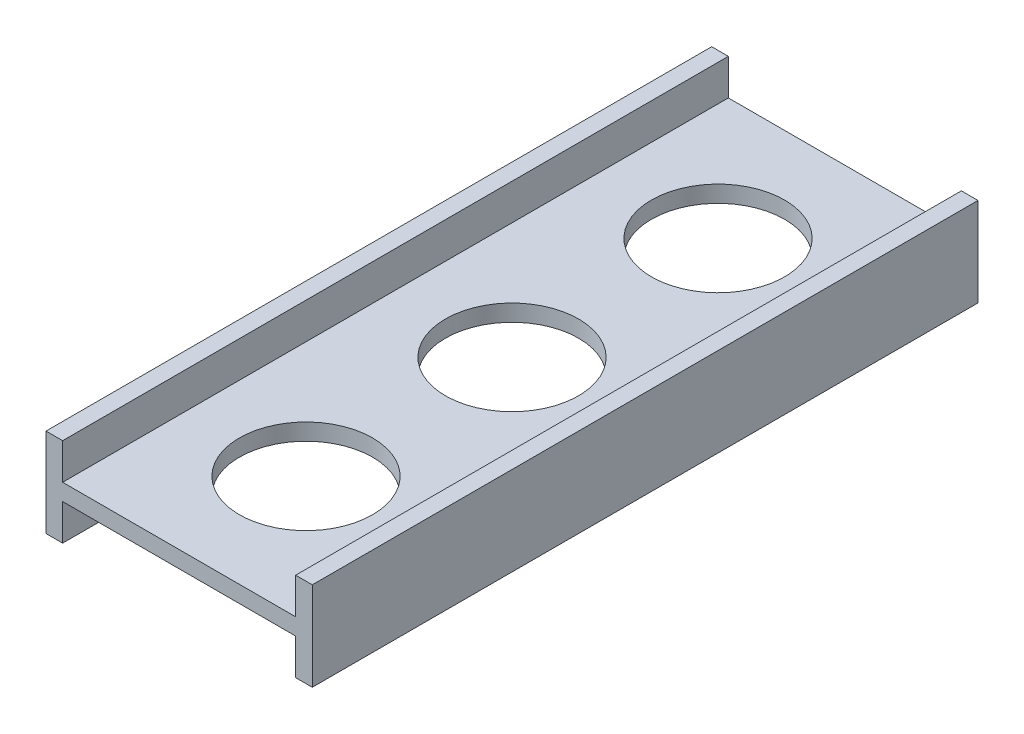
ISO-10303-21;
HEADER;
FILE_DESCRIPTION(('STEP AP214'),'2;1');
FILE_NAME('part.step','',(''),(''),'','','');
FILE_SCHEMA(('AUTOMOTIVE_DESIGN { 1 0 10303 214 1 1 1 1 }'));
ENDSEC;
DATA;
#1=APPLICATION_CONTEXT('core data for automotive mechanical design processes');
#2=APPLICATION_PROTOCOL_DEFINITION('international standard','automotive_design',2000,#1);
#3=PRODUCT_CONTEXT('',#1,'mechanical');
#4=PRODUCT('Part','Part','',(#3));
#5=PRODUCT_RELATED_PRODUCT_CATEGORY('part','',(#4));
#6=PRODUCT_DEFINITION_FORMATION('','',#4);
#7=PRODUCT_DEFINITION_CONTEXT('part definition',#1,'design');
#8=PRODUCT_DEFINITION('design','',#6,#7);
#9=PRODUCT_DEFINITION_SHAPE('','',#8);
#10=(LENGTH_UNIT() NAMED_UNIT(*) SI_UNIT(.MILLI.,.METRE.));
#11=(NAMED_UNIT(*) PLANE_ANGLE_UNIT() SI_UNIT($,.RADIAN.));
#12=(NAMED_UNIT(*) SI_UNIT($,.STERADIAN.) SOLID_ANGLE_UNIT());
#13=UNCERTAINTY_MEASURE_WITH_UNIT(LENGTH_MEASURE(1.E-05),#10,'distance_accuracy_value','');
#14=(GEOMETRIC_REPRESENTATION_CONTEXT(3) GLOBAL_UNCERTAINTY_ASSIGNED_CONTEXT((#13)) GLOBAL_UNIT_ASSIGNED_CONTEXT((#10,
#11,#12)) REPRESENTATION_CONTEXT('',''));
#15=CARTESIAN_POINT('',(0.,0.,0.));
#16=DIRECTION('',(0.,0.,1.));
#17=DIRECTION('',(1.,0.,0.));
#18=AXIS2_PLACEMENT_3D('',#15,#16,#17);
#19=CARTESIAN_POINT('',(0.,50.8,-381.));
#20=DIRECTION('',(-1.,0.,0.));
#21=DIRECTION('',(0.,-1.,0.));
#22=AXIS2_PLACEMENT_3D('',#19,#20,#21);
#23=PLANE('',#22);
#24=DIRECTION('',(0.,-1.,0.));
#25=VECTOR('',#24,1.);
#26=CARTESIAN_POINT('',(0.,50.8,0.));
#27=LINE('',#26,#25);
#28=CARTESIAN_POINT('',(0.,50.8,0.));
#29=VERTEX_POINT('',#28);
#30=CARTESIAN_POINT('',(0.,0.,0.));
#31=VERTEX_POINT('',#30);
#32=EDGE_CURVE('E153',#29,#31,#27,.T.);
#33=ORIENTED_EDGE('',*,*,#32,.F.);
#34=DIRECTION('',(0.,0.,1.));
#35=VECTOR('',#34,1.);
#36=CARTESIAN_POINT('',(0.,50.8,-381.));
#37=LINE('',#36,#35);
#38=CARTESIAN_POINT('',(0.,50.8,-381.));
#39=VERTEX_POINT('',#38);
#40=EDGE_CURVE('E11',#39,#29,#37,.T.);
#41=ORIENTED_EDGE('',*,*,#40,.F.);
#42=DIRECTION('',(0.,-1.,0.));
#43=VECTOR('',#42,1.);
#44=CARTESIAN_POINT('',(0.,50.8,-381.));
#45=LINE('',#44,#43);
#46=CARTESIAN_POINT('',(0.,0.,-381.));
#47=VERTEX_POINT('',#46);
#48=EDGE_CURVE('E186',#39,#47,#45,.T.);
#49=ORIENTED_EDGE('',*,*,#48,.T.);
#50=DIRECTION('',(0.,0.,1.));
#51=VECTOR('',#50,1.);
#52=CARTESIAN_POINT('',(0.,0.,-381.));
#53=LINE('',#52,#51);
#54=EDGE_CURVE('E99',#47,#31,#53,.T.);
#55=ORIENTED_EDGE('',*,*,#54,.T.);
#56=EDGE_LOOP('',(#33,#41,#49,#55));
#57=FACE_BOUND('',#56,.T.);
#58=ADVANCED_FACE('F31',(#57),#23,.T.);
#59=CARTESIAN_POINT('',(9.52500000000001,50.8,-381.));
#60=DIRECTION('',(0.,1.,0.));
#61=DIRECTION('',(0.,0.,1.));
#62=AXIS2_PLACEMENT_3D('',#59,#60,#61);
#63=PLANE('',#62);
#64=DIRECTION('',(-1.,0.,0.));
#65=VECTOR('',#64,1.);
#66=CARTESIAN_POINT('',(9.52500000000001,50.8,0.));
#67=LINE('',#66,#65);
#68=CARTESIAN_POINT('',(9.52500000000001,50.8,0.));
#69=VERTEX_POINT('',#68);
#70=EDGE_CURVE('E184',#69,#29,#67,.T.);
#71=ORIENTED_EDGE('',*,*,#70,.F.);
#72=DIRECTION('',(0.,0.,1.));
#73=VECTOR('',#72,1.);
#74=CARTESIAN_POINT('',(9.52500000000001,50.8,-381.));
#75=LINE('',#74,#73);
#76=CARTESIAN_POINT('',(9.52500000000001,50.8,-381.));
#77=VERTEX_POINT('',#76);
#78=EDGE_CURVE('E40',#77,#69,#75,.T.);
#79=ORIENTED_EDGE('',*,*,#78,.F.);
#80=DIRECTION('',(-1.,0.,0.));
#81=VECTOR('',#80,1.);
#82=CARTESIAN_POINT('',(9.52500000000001,50.8,-381.));
#83=LINE('',#82,#81);
#84=EDGE_CURVE('E143',#77,#39,#83,.T.);
#85=ORIENTED_EDGE('',*,*,#84,.T.);
#86=ORIENTED_EDGE('',*,*,#40,.T.);
#87=EDGE_LOOP('',(#71,#79,#85,#86));
#88=FACE_BOUND('',#87,.T.);
#89=ADVANCED_FACE('F268',(#88),#63,.T.);
#90=CARTESIAN_POINT('',(9.525,30.1752,-381.));
#91=DIRECTION('',(1.,0.,0.));
#92=DIRECTION('',(0.,1.,0.));
#93=AXIS2_PLACEMENT_3D('',#90,#91,#92);
#94=PLANE('',#93);
#95=DIRECTION('',(0.,1.,0.));
#96=VECTOR('',#95,1.);
#97=CARTESIAN_POINT('',(9.525,30.1752,0.));
#98=LINE('',#97,#96);
#99=CARTESIAN_POINT('',(9.525,30.1752,0.));
#100=VERTEX_POINT('',#99);
#101=EDGE_CURVE('E130',#100,#69,#98,.T.);
#102=ORIENTED_EDGE('',*,*,#101,.F.);
#103=DIRECTION('',(0.,0.,1.));
#104=VECTOR('',#103,1.);
#105=CARTESIAN_POINT('',(9.525,30.1752,-381.));
#106=LINE('',#105,#104);
#107=CARTESIAN_POINT('',(9.525,30.1752,-381.));
#108=VERTEX_POINT('',#107);
#109=EDGE_CURVE('E125',#108,#100,#106,.T.);
#110=ORIENTED_EDGE('',*,*,#109,.F.);
#111=DIRECTION('',(0.,1.,0.));
#112=VECTOR('',#111,1.);
#113=CARTESIAN_POINT('',(9.525,30.1752,-381.));
#114=LINE('',#113,#112);
#115=EDGE_CURVE('E128',#108,#77,#114,.T.);
#116=ORIENTED_EDGE('',*,*,#115,.T.);
#117=ORIENTED_EDGE('',*,*,#78,.T.);
#118=EDGE_LOOP('',(#102,#110,#116,#117));
#119=FACE_BOUND('',#118,.T.);
#120=ADVANCED_FACE('F127',(#119),#94,.T.);
#121=CARTESIAN_POINT('',(142.875,30.1752,-381.));
#122=DIRECTION('',(0.,1.,0.));
#123=DIRECTION('',(-1.,0.,0.));
#124=AXIS2_PLACEMENT_3D('',#121,#122,#123);
#125=PLANE('',#124);
#126=CARTESIAN_POINT('',(76.2,30.1752,-72.5919338839558));
#127=DIRECTION('',(0.,1.,0.));
#128=DIRECTION('',(1.,0.,0.));
#129=AXIS2_PLACEMENT_3D('',#126,#127,#128);
#130=CIRCLE('',#129,38.1);
#131=CARTESIAN_POINT('',(114.3,30.1752,-72.5919338839558));
#132=VERTEX_POINT('',#131);
#133=EDGE_CURVE('E219',#132,#132,#130,.T.);
#134=ORIENTED_EDGE('',*,*,#133,.F.);
#135=EDGE_LOOP('',(#134));
#136=FACE_BOUND('',#135,.T.);
#137=CARTESIAN_POINT('',(76.2,30.1752,-308.408066116044));
#138=DIRECTION('',(0.,1.,0.));
#139=DIRECTION('',(-1.,0.,0.));
#140=AXIS2_PLACEMENT_3D('',#137,#138,#139);
#141=CIRCLE('',#140,38.1);
#142=CARTESIAN_POINT('',(38.1,30.1752,-308.408066116044));
#143=VERTEX_POINT('',#142);
#144=EDGE_CURVE('E209',#143,#143,#141,.T.);
#145=ORIENTED_EDGE('',*,*,#144,.F.);
#146=EDGE_LOOP('',(#145));
#147=FACE_BOUND('',#146,.T.);
#148=CARTESIAN_POINT('',(76.2,30.1752,-190.5));
#149=DIRECTION('',(0.,1.,0.));
#150=DIRECTION('',(-1.,0.,0.));
#151=AXIS2_PLACEMENT_3D('',#148,#149,#150);
#152=CIRCLE('',#151,38.1);
#153=CARTESIAN_POINT('',(38.1,30.1752,-190.5));
#154=VERTEX_POINT('',#153);
#155=EDGE_CURVE('E206',#154,#154,#152,.T.);
#156=ORIENTED_EDGE('',*,*,#155,.F.);
#157=EDGE_LOOP('',(#156));
#158=FACE_BOUND('',#157,.T.);
#159=DIRECTION('',(-1.,0.,0.));
#160=VECTOR('',#159,1.);
#161=CARTESIAN_POINT('',(142.875,30.1752,0.));
#162=LINE('',#161,#160);
#163=CARTESIAN_POINT('',(142.875,30.1752,0.));
#164=VERTEX_POINT('',#163);
#165=EDGE_CURVE('E181',#164,#100,#162,.T.);
#166=ORIENTED_EDGE('',*,*,#165,.F.);
#167=DIRECTION('',(0.,0.,1.));
#168=VECTOR('',#167,1.);
#169=CARTESIAN_POINT('',(142.875,30.1752,-381.));
#170=LINE('',#169,#168);
#171=CARTESIAN_POINT('',(142.875,30.1752,-381.));
#172=VERTEX_POINT('',#171);
#173=EDGE_CURVE('E135',#172,#164,#170,.T.);
#174=ORIENTED_EDGE('',*,*,#173,.F.);
#175=DIRECTION('',(-1.,0.,0.));
#176=VECTOR('',#175,1.);
#177=CARTESIAN_POINT('',(142.875,30.1752,-381.));
#178=LINE('',#177,#176);
#179=EDGE_CURVE('E141',#172,#108,#178,.T.);
#180=ORIENTED_EDGE('',*,*,#179,.T.);
#181=ORIENTED_EDGE('',*,*,#109,.T.);
#182=EDGE_LOOP('',(#166,#174,#180,#181));
#183=FACE_BOUND('',#182,.T.);
#184=ADVANCED_FACE('F145',(#136,#147,#158,#183),#125,.T.);
#185=CARTESIAN_POINT('',(142.875,50.8,-381.));
#186=DIRECTION('',(-1.,0.,0.));
#187=DIRECTION('',(0.,-1.,0.));
#188=AXIS2_PLACEMENT_3D('',#185,#186,#187);
#189=PLANE('',#188);
#190=DIRECTION('',(0.,-1.,0.));
#191=VECTOR('',#190,1.);
#192=CARTESIAN_POINT('',(142.875,50.8,0.));
#193=LINE('',#192,#191);
#194=CARTESIAN_POINT('',(142.875,50.8,0.));
#195=VERTEX_POINT('',#194);
#196=EDGE_CURVE('E178',#195,#164,#193,.T.);
#197=ORIENTED_EDGE('',*,*,#196,.F.);
#198=DIRECTION('',(0.,0.,1.));
#199=VECTOR('',#198,1.);
#200=CARTESIAN_POINT('',(142.875,50.8,-381.));
#201=LINE('',#200,#199);
#202=CARTESIAN_POINT('',(142.875,50.8,-381.));
#203=VERTEX_POINT('',#202);
#204=EDGE_CURVE('E190',#203,#195,#201,.T.);
#205=ORIENTED_EDGE('',*,*,#204,.F.);
#206=DIRECTION('',(0.,-1.,0.));
#207=VECTOR('',#206,1.);
#208=CARTESIAN_POINT('',(142.875,50.8,-381.));
#209=LINE('',#208,#207);
#210=EDGE_CURVE('E146',#203,#172,#209,.T.);
#211=ORIENTED_EDGE('',*,*,#210,.T.);
#212=ORIENTED_EDGE('',*,*,#173,.T.);
#213=EDGE_LOOP('',(#197,#205,#211,#212));
#214=FACE_BOUND('',#213,.T.);
#215=ADVANCED_FACE('F281',(#214),#189,.T.);
#216=CARTESIAN_POINT('',(152.4,50.8,-381.));
#217=DIRECTION('',(0.,1.,0.));
#218=DIRECTION('',(0.,0.,1.));
#219=AXIS2_PLACEMENT_3D('',#216,#217,#218);
#220=PLANE('',#219);
#221=DIRECTION('',(-1.,0.,0.));
#222=VECTOR('',#221,1.);
#223=CARTESIAN_POINT('',(152.4,50.8,0.));
#224=LINE('',#223,#222);
#225=CARTESIAN_POINT('',(152.4,50.8,0.));
#226=VERTEX_POINT('',#225);
#227=EDGE_CURVE('E175',#226,#195,#224,.T.);
#228=ORIENTED_EDGE('',*,*,#227,.F.);
#229=DIRECTION('',(0.,0.,1.));
#230=VECTOR('',#229,1.);
#231=CARTESIAN_POINT('',(152.4,50.8,-381.));
#232=LINE('',#231,#230);
#233=CARTESIAN_POINT('',(152.4,50.8,-381.));
#234=VERTEX_POINT('',#233);
#235=EDGE_CURVE('E192',#234,#226,#232,.T.);
#236=ORIENTED_EDGE('',*,*,#235,.F.);
#237=DIRECTION('',(-1.,0.,0.));
#238=VECTOR('',#237,1.);
#239=CARTESIAN_POINT('',(152.4,50.8,-381.));
#240=LINE('',#239,#238);
#241=EDGE_CURVE('E148',#234,#203,#240,.T.);
#242=ORIENTED_EDGE('',*,*,#241,.T.);
#243=ORIENTED_EDGE('',*,*,#204,.T.);
#244=EDGE_LOOP('',(#228,#236,#242,#243));
#245=FACE_BOUND('',#244,.T.);
#246=ADVANCED_FACE('F243',(#245),#220,.T.);
#247=CARTESIAN_POINT('',(152.4,0.,-381.));
#248=DIRECTION('',(1.,0.,0.));
#249=DIRECTION('',(0.,0.,-1.));
#250=AXIS2_PLACEMENT_3D('',#247,#248,#249);
#251=PLANE('',#250);
#252=DIRECTION('',(0.,1.,0.));
#253=VECTOR('',#252,1.);
#254=CARTESIAN_POINT('',(152.4,0.,0.));
#255=LINE('',#254,#253);
#256=CARTESIAN_POINT('',(152.4,0.,0.));
#257=VERTEX_POINT('',#256);
#258=EDGE_CURVE('E172',#257,#226,#255,.T.);
#259=ORIENTED_EDGE('',*,*,#258,.F.);
#260=DIRECTION('',(0.,0.,1.));
#261=VECTOR('',#260,1.);
#262=CARTESIAN_POINT('',(152.4,0.,-381.));
#263=LINE('',#262,#261);
#264=CARTESIAN_POINT('',(152.4,0.,-381.));
#265=VERTEX_POINT('',#264);
#266=EDGE_CURVE('E194',#265,#257,#263,.T.);
#267=ORIENTED_EDGE('',*,*,#266,.F.);
#268=DIRECTION('',(0.,1.,0.));
#269=VECTOR('',#268,1.);
#270=CARTESIAN_POINT('',(152.4,0.,-381.));
#271=LINE('',#270,#269);
#272=EDGE_CURVE('E237',#265,#234,#271,.T.);
#273=ORIENTED_EDGE('',*,*,#272,.T.);
#274=ORIENTED_EDGE('',*,*,#235,.T.);
#275=EDGE_LOOP('',(#259,#267,#273,#274));
#276=FACE_BOUND('',#275,.T.);
#277=ADVANCED_FACE('F249',(#276),#251,.T.);
#278=CARTESIAN_POINT('',(142.875,0.,-381.));
#279=DIRECTION('',(0.,-1.,0.));
#280=DIRECTION('',(0.,0.,-1.));
#281=AXIS2_PLACEMENT_3D('',#278,#279,#280);
#282=PLANE('',#281);
#283=DIRECTION('',(1.,0.,0.));
#284=VECTOR('',#283,1.);
#285=CARTESIAN_POINT('',(142.875,0.,0.));
#286=LINE('',#285,#284);
#287=CARTESIAN_POINT('',(142.875,0.,0.));
#288=VERTEX_POINT('',#287);
#289=EDGE_CURVE('E169',#288,#257,#286,.T.);
#290=ORIENTED_EDGE('',*,*,#289,.F.);
#291=DIRECTION('',(0.,0.,1.));
#292=VECTOR('',#291,1.);
#293=CARTESIAN_POINT('',(142.875,0.,-381.));
#294=LINE('',#293,#292);
#295=CARTESIAN_POINT('',(142.875,0.,-381.));
#296=VERTEX_POINT('',#295);
#297=EDGE_CURVE('E196',#296,#288,#294,.T.);
#298=ORIENTED_EDGE('',*,*,#297,.F.);
#299=DIRECTION('',(1.,0.,0.));
#300=VECTOR('',#299,1.);
#301=CARTESIAN_POINT('',(142.875,0.,-381.));
#302=LINE('',#301,#300);
#303=EDGE_CURVE('E234',#296,#265,#302,.T.);
#304=ORIENTED_EDGE('',*,*,#303,.T.);
#305=ORIENTED_EDGE('',*,*,#266,.T.);
#306=EDGE_LOOP('',(#290,#298,#304,#305));
#307=FACE_BOUND('',#306,.T.);
#308=ADVANCED_FACE('F252',(#307),#282,.T.);
#309=CARTESIAN_POINT('',(142.875,20.6248,-381.));
#310=DIRECTION('',(-1.,0.,0.));
#311=DIRECTION('',(0.,0.,1.));
#312=AXIS2_PLACEMENT_3D('',#309,#310,#311);
#313=PLANE('',#312);
#314=DIRECTION('',(0.,-1.,0.));
#315=VECTOR('',#314,1.);
#316=CARTESIAN_POINT('',(142.875,20.6248,0.));
#317=LINE('',#316,#315);
#318=CARTESIAN_POINT('',(142.875,20.6248,0.));
#319=VERTEX_POINT('',#318);
#320=EDGE_CURVE('E166',#319,#288,#317,.T.);
#321=ORIENTED_EDGE('',*,*,#320,.F.);
#322=DIRECTION('',(0.,0.,1.));
#323=VECTOR('',#322,1.);
#324=CARTESIAN_POINT('',(142.875,20.6248,-381.));
#325=LINE('',#324,#323);
#326=CARTESIAN_POINT('',(142.875,20.6248,-381.));
#327=VERTEX_POINT('',#326);
#328=EDGE_CURVE('E198',#327,#319,#325,.T.);
#329=ORIENTED_EDGE('',*,*,#328,.F.);
#330=DIRECTION('',(0.,-1.,0.));
#331=VECTOR('',#330,1.);
#332=CARTESIAN_POINT('',(142.875,20.6248,-381.));
#333=LINE('',#332,#331);
#334=EDGE_CURVE('E231',#327,#296,#333,.T.);
#335=ORIENTED_EDGE('',*,*,#334,.T.);
#336=ORIENTED_EDGE('',*,*,#297,.T.);
#337=EDGE_LOOP('',(#321,#329,#335,#336));
#338=FACE_BOUND('',#337,.T.);
#339=ADVANCED_FACE('F257',(#338),#313,.T.);
#340=CARTESIAN_POINT('',(9.525,20.6248,-381.));
#341=DIRECTION('',(0.,-1.,0.));
#342=DIRECTION('',(0.,0.,-1.));
#343=AXIS2_PLACEMENT_3D('',#340,#341,#342);
#344=PLANE('',#343);
#345=CARTESIAN_POINT('',(76.2,20.6248,-72.5919338839558));
#346=DIRECTION('',(0.,-1.,0.));
#347=DIRECTION('',(0.,0.,-1.));
#348=AXIS2_PLACEMENT_3D('',#345,#346,#347);
#349=CIRCLE('',#348,38.1);
#350=CARTESIAN_POINT('',(76.2,20.6248,-110.691933883956));
#351=VERTEX_POINT('',#350);
#352=EDGE_CURVE('E34',#351,#351,#349,.T.);
#353=ORIENTED_EDGE('',*,*,#352,.F.);
#354=EDGE_LOOP('',(#353));
#355=FACE_BOUND('',#354,.T.);
#356=CARTESIAN_POINT('',(76.2,20.6248,-308.408066116044));
#357=DIRECTION('',(0.,-1.,0.));
#358=DIRECTION('',(0.,0.,-1.));
#359=AXIS2_PLACEMENT_3D('',#356,#357,#358);
#360=CIRCLE('',#359,38.1);
#361=CARTESIAN_POINT('',(76.2,20.6248,-346.508066116044));
#362=VERTEX_POINT('',#361);
#363=EDGE_CURVE('E207',#362,#362,#360,.T.);
#364=ORIENTED_EDGE('',*,*,#363,.F.);
#365=EDGE_LOOP('',(#364));
#366=FACE_BOUND('',#365,.T.);
#367=CARTESIAN_POINT('',(76.2,20.6248,-190.5));
#368=DIRECTION('',(0.,-1.,0.));
#369=DIRECTION('',(0.,0.,-1.));
#370=AXIS2_PLACEMENT_3D('',#367,#368,#369);
#371=CIRCLE('',#370,38.1);
#372=CARTESIAN_POINT('',(76.2,20.6248,-228.6));
#373=VERTEX_POINT('',#372);
#374=EDGE_CURVE('E157',#373,#373,#371,.T.);
#375=ORIENTED_EDGE('',*,*,#374,.F.);
#376=EDGE_LOOP('',(#375));
#377=FACE_BOUND('',#376,.T.);
#378=DIRECTION('',(1.,0.,0.));
#379=VECTOR('',#378,1.);
#380=CARTESIAN_POINT('',(9.525,20.6248,0.));
#381=LINE('',#380,#379);
#382=CARTESIAN_POINT('',(9.525,20.6248,0.));
#383=VERTEX_POINT('',#382);
#384=EDGE_CURVE('E163',#383,#319,#381,.T.);
#385=ORIENTED_EDGE('',*,*,#384,.F.);
#386=DIRECTION('',(0.,0.,1.));
#387=VECTOR('',#386,1.);
#388=CARTESIAN_POINT('',(9.525,20.6248,-381.));
#389=LINE('',#388,#387);
#390=CARTESIAN_POINT('',(9.525,20.6248,-381.));
#391=VERTEX_POINT('',#390);
#392=EDGE_CURVE('E200',#391,#383,#389,.T.);
#393=ORIENTED_EDGE('',*,*,#392,.F.);
#394=DIRECTION('',(1.,0.,0.));
#395=VECTOR('',#394,1.);
#396=CARTESIAN_POINT('',(9.525,20.6248,-381.));
#397=LINE('',#396,#395);
#398=EDGE_CURVE('E228',#391,#327,#397,.T.);
#399=ORIENTED_EDGE('',*,*,#398,.T.);
#400=ORIENTED_EDGE('',*,*,#328,.T.);
#401=EDGE_LOOP('',(#385,#393,#399,#400));
#402=FACE_BOUND('',#401,.T.);
#403=ADVANCED_FACE('F260',(#355,#366,#377,#402),#344,.T.);
#404=CARTESIAN_POINT('',(9.525,0.,-381.));
#405=DIRECTION('',(1.,0.,0.));
#406=DIRECTION('',(0.,0.,-1.));
#407=AXIS2_PLACEMENT_3D('',#404,#405,#406);
#408=PLANE('',#407);
#409=DIRECTION('',(0.,1.,0.));
#410=VECTOR('',#409,1.);
#411=CARTESIAN_POINT('',(9.525,0.,0.));
#412=LINE('',#411,#410);
#413=CARTESIAN_POINT('',(9.525,0.,0.));
#414=VERTEX_POINT('',#413);
#415=EDGE_CURVE('E160',#414,#383,#412,.T.);
#416=ORIENTED_EDGE('',*,*,#415,.F.);
#417=DIRECTION('',(0.,0.,1.));
#418=VECTOR('',#417,1.);
#419=CARTESIAN_POINT('',(9.525,0.,-381.));
#420=LINE('',#419,#418);
#421=CARTESIAN_POINT('',(9.525,0.,-381.));
#422=VERTEX_POINT('',#421);
#423=EDGE_CURVE('E202',#422,#414,#420,.T.);
#424=ORIENTED_EDGE('',*,*,#423,.F.);
#425=DIRECTION('',(0.,1.,0.));
#426=VECTOR('',#425,1.);
#427=CARTESIAN_POINT('',(9.525,0.,-381.));
#428=LINE('',#427,#426);
#429=EDGE_CURVE('E225',#422,#391,#428,.T.);
#430=ORIENTED_EDGE('',*,*,#429,.T.);
#431=ORIENTED_EDGE('',*,*,#392,.T.);
#432=EDGE_LOOP('',(#416,#424,#430,#431));
#433=FACE_BOUND('',#432,.T.);
#434=ADVANCED_FACE('F264',(#433),#408,.T.);
#435=CARTESIAN_POINT('',(0.,0.,-381.));
#436=DIRECTION('',(0.,-1.,0.));
#437=DIRECTION('',(0.,0.,-1.));
#438=AXIS2_PLACEMENT_3D('',#435,#436,#437);
#439=PLANE('',#438);
#440=DIRECTION('',(1.,0.,0.));
#441=VECTOR('',#440,1.);
#442=CARTESIAN_POINT('',(0.,0.,0.));
#443=LINE('',#442,#441);
#444=EDGE_CURVE('E156',#31,#414,#443,.T.);
#445=ORIENTED_EDGE('',*,*,#444,.F.);
#446=ORIENTED_EDGE('',*,*,#54,.F.);
#447=DIRECTION('',(1.,0.,0.));
#448=VECTOR('',#447,1.);
#449=CARTESIAN_POINT('',(0.,0.,-381.));
#450=LINE('',#449,#448);
#451=EDGE_CURVE('E223',#47,#422,#450,.T.);
#452=ORIENTED_EDGE('',*,*,#451,.T.);
#453=ORIENTED_EDGE('',*,*,#423,.T.);
#454=EDGE_LOOP('',(#445,#446,#452,#453));
#455=FACE_BOUND('',#454,.T.);
#456=ADVANCED_FACE('F265',(#455),#439,.T.);
#457=CARTESIAN_POINT('',(0.,0.,-381.));
#458=DIRECTION('',(0.,0.,1.));
#459=DIRECTION('',(1.,0.,0.));
#460=AXIS2_PLACEMENT_3D('',#457,#458,#459);
#461=PLANE('',#460);
#462=ORIENTED_EDGE('',*,*,#48,.F.);
#463=ORIENTED_EDGE('',*,*,#84,.F.);
#464=ORIENTED_EDGE('',*,*,#115,.F.);
#465=ORIENTED_EDGE('',*,*,#179,.F.);
#466=ORIENTED_EDGE('',*,*,#210,.F.);
#467=ORIENTED_EDGE('',*,*,#241,.F.);
#468=ORIENTED_EDGE('',*,*,#272,.F.);
#469=ORIENTED_EDGE('',*,*,#303,.F.);
#470=ORIENTED_EDGE('',*,*,#334,.F.);
#471=ORIENTED_EDGE('',*,*,#398,.F.);
#472=ORIENTED_EDGE('',*,*,#429,.F.);
#473=ORIENTED_EDGE('',*,*,#451,.F.);
#474=EDGE_LOOP('',(#462,#463,#464,#465,#466,#467,#468,#469,#470,#471,#472,#473));
#475=FACE_BOUND('',#474,.T.);
#476=ADVANCED_FACE('F139',(#475),#461,.F.);
#477=CARTESIAN_POINT('',(0.,0.,0.));
#478=DIRECTION('',(0.,0.,1.));
#479=DIRECTION('',(1.,0.,0.));
#480=AXIS2_PLACEMENT_3D('',#477,#478,#479);
#481=PLANE('',#480);
#482=ORIENTED_EDGE('',*,*,#32,.T.);
#483=ORIENTED_EDGE('',*,*,#444,.T.);
#484=ORIENTED_EDGE('',*,*,#415,.T.);
#485=ORIENTED_EDGE('',*,*,#384,.T.);
#486=ORIENTED_EDGE('',*,*,#320,.T.);
#487=ORIENTED_EDGE('',*,*,#289,.T.);
#488=ORIENTED_EDGE('',*,*,#258,.T.);
#489=ORIENTED_EDGE('',*,*,#227,.T.);
#490=ORIENTED_EDGE('',*,*,#196,.T.);
#491=ORIENTED_EDGE('',*,*,#165,.T.);
#492=ORIENTED_EDGE('',*,*,#101,.T.);
#493=ORIENTED_EDGE('',*,*,#70,.T.);
#494=EDGE_LOOP('',(#482,#483,#484,#485,#486,#487,#488,#489,#490,#491,#492,#493));
#495=FACE_BOUND('',#494,.T.);
#496=ADVANCED_FACE('F267',(#495),#481,.T.);
#497=CARTESIAN_POINT('',(76.2000000000001,-858.8248,-190.5));
#498=DIRECTION('',(0.,1.,0.));
#499=DIRECTION('',(-1.,0.,0.));
#500=AXIS2_PLACEMENT_3D('',#497,#498,#499);
#501=CYLINDRICAL_SURFACE('',#500,38.1);
#502=ORIENTED_EDGE('',*,*,#374,.T.);
#503=EDGE_LOOP('',(#502));
#504=FACE_BOUND('',#503,.T.);
#505=ORIENTED_EDGE('',*,*,#155,.T.);
#506=EDGE_LOOP('',(#505));
#507=FACE_BOUND('',#506,.T.);
#508=ADVANCED_FACE('F305',(#504,#507),#501,.F.);
#509=CARTESIAN_POINT('',(76.2000000000001,-858.8248,-308.408066116044));
#510=DIRECTION('',(0.,1.,0.));
#511=DIRECTION('',(-1.,0.,0.));
#512=AXIS2_PLACEMENT_3D('',#509,#510,#511);
#513=CYLINDRICAL_SURFACE('',#512,38.1);
#514=ORIENTED_EDGE('',*,*,#363,.T.);
#515=EDGE_LOOP('',(#514));
#516=FACE_BOUND('',#515,.T.);
#517=ORIENTED_EDGE('',*,*,#144,.T.);
#518=EDGE_LOOP('',(#517));
#519=FACE_BOUND('',#518,.T.);
#520=ADVANCED_FACE('F309',(#516,#519),#513,.F.);
#521=CARTESIAN_POINT('',(76.2000000000001,-858.8248,-72.5919338839558));
#522=DIRECTION('',(0.,1.,0.));
#523=DIRECTION('',(-1.,0.,0.));
#524=AXIS2_PLACEMENT_3D('',#521,#522,#523);
#525=CYLINDRICAL_SURFACE('',#524,38.1);
#526=ORIENTED_EDGE('',*,*,#352,.T.);
#527=EDGE_LOOP('',(#526));
#528=FACE_BOUND('',#527,.T.);
#529=ORIENTED_EDGE('',*,*,#133,.T.);
#530=EDGE_LOOP('',(#529));
#531=FACE_BOUND('',#530,.T.);
#532=ADVANCED_FACE('F313',(#528,#531),#525,.F.);
#533=CLOSED_SHELL('',(#58,#89,#120,#184,#215,#246,#277,#308,#339,#403,#434,#456,#476,#496,#508,
#520,#532));
#534=MANIFOLD_SOLID_BREP('B2',#533);
#535=ADVANCED_BREP_SHAPE_REPRESENTATION('',(#18,#534),#14);
#536=SHAPE_DEFINITION_REPRESENTATION(#9,#535);
ENDSEC;
END-ISO-10303-21;
